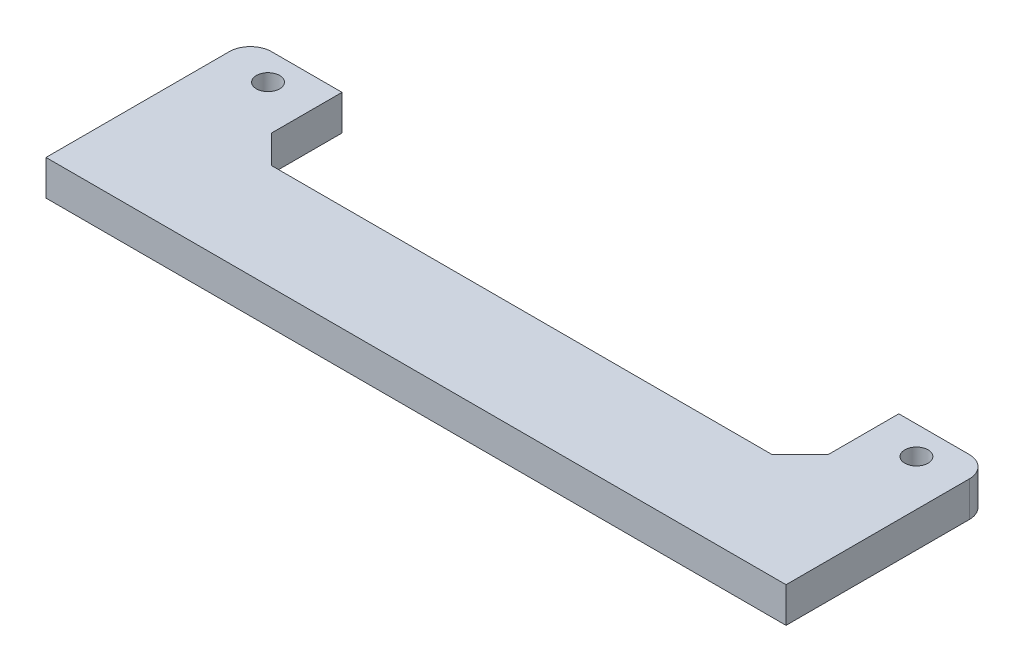
ISO-10303-21;
HEADER;
FILE_DESCRIPTION(('STEP AP214'),'2;1');
FILE_NAME('part.step','',(''),(''),'','','');
FILE_SCHEMA(('AUTOMOTIVE_DESIGN { 1 0 10303 214 1 1 1 1 }'));
ENDSEC;
DATA;
#1=APPLICATION_CONTEXT('core data for automotive mechanical design processes');
#2=APPLICATION_PROTOCOL_DEFINITION('international standard','automotive_design',2000,#1);
#3=PRODUCT_CONTEXT('',#1,'mechanical');
#4=PRODUCT('Part','Part','',(#3));
#5=PRODUCT_RELATED_PRODUCT_CATEGORY('part','',(#4));
#6=PRODUCT_DEFINITION_FORMATION('','',#4);
#7=PRODUCT_DEFINITION_CONTEXT('part definition',#1,'design');
#8=PRODUCT_DEFINITION('design','',#6,#7);
#9=PRODUCT_DEFINITION_SHAPE('','',#8);
#10=(LENGTH_UNIT() NAMED_UNIT(*) SI_UNIT(.MILLI.,.METRE.));
#11=(NAMED_UNIT(*) PLANE_ANGLE_UNIT() SI_UNIT($,.RADIAN.));
#12=(NAMED_UNIT(*) SI_UNIT($,.STERADIAN.) SOLID_ANGLE_UNIT());
#13=UNCERTAINTY_MEASURE_WITH_UNIT(LENGTH_MEASURE(1.E-05),#10,'distance_accuracy_value','');
#14=(GEOMETRIC_REPRESENTATION_CONTEXT(3) GLOBAL_UNCERTAINTY_ASSIGNED_CONTEXT((#13)) GLOBAL_UNIT_ASSIGNED_CONTEXT((#10,
#11,#12)) REPRESENTATION_CONTEXT('',''));
#15=CARTESIAN_POINT('',(0.,0.,0.));
#16=DIRECTION('',(0.,0.,1.));
#17=DIRECTION('',(1.,0.,0.));
#18=AXIS2_PLACEMENT_3D('',#15,#16,#17);
#19=CARTESIAN_POINT('',(0.,5.,0.));
#20=DIRECTION('',(0.,-1.,0.));
#21=DIRECTION('',(0.,0.,-1.));
#22=AXIS2_PLACEMENT_3D('',#19,#20,#21);
#23=PLANE('',#22);
#24=DIRECTION('',(0.,0.,1.));
#25=VECTOR('',#24,1.);
#26=CARTESIAN_POINT('',(52.5,5.,0.));
#27=LINE('',#26,#25);
#28=CARTESIAN_POINT('',(52.5,5.,-26.));
#29=VERTEX_POINT('',#28);
#30=CARTESIAN_POINT('',(52.5,5.,0.));
#31=VERTEX_POINT('',#30);
#32=EDGE_CURVE('E124',#29,#31,#27,.T.);
#33=ORIENTED_EDGE('',*,*,#32,.F.);
#34=CARTESIAN_POINT('',(49.5,5.,-26.));
#35=DIRECTION('',(0.,-1.,0.));
#36=DIRECTION('',(0.,0.,-1.));
#37=AXIS2_PLACEMENT_3D('',#34,#35,#36);
#38=CIRCLE('',#37,3.);
#39=CARTESIAN_POINT('',(49.5,5.,-29.));
#40=VERTEX_POINT('',#39);
#41=EDGE_CURVE('E211',#29,#40,#38,.F.);
#42=ORIENTED_EDGE('',*,*,#41,.T.);
#43=DIRECTION('',(1.,0.,0.));
#44=VECTOR('',#43,1.);
#45=CARTESIAN_POINT('',(52.5,5.,-29.));
#46=LINE('',#45,#44);
#47=CARTESIAN_POINT('',(39.5,5.,-29.));
#48=VERTEX_POINT('',#47);
#49=EDGE_CURVE('E133',#48,#40,#46,.T.);
#50=ORIENTED_EDGE('',*,*,#49,.F.);
#51=DIRECTION('',(0.,0.,-1.));
#52=VECTOR('',#51,1.);
#53=CARTESIAN_POINT('',(39.5,5.,-29.));
#54=LINE('',#53,#52);
#55=CARTESIAN_POINT('',(39.5,5.,-19.));
#56=VERTEX_POINT('',#55);
#57=EDGE_CURVE('E156',#56,#48,#54,.T.);
#58=ORIENTED_EDGE('',*,*,#57,.F.);
#59=DIRECTION('',(-0.707106781186553,0.,0.707106781186542));
#60=VECTOR('',#59,1.);
#61=CARTESIAN_POINT('',(10.2499999999997,5.,10.2499999999999));
#62=LINE('',#61,#60);
#63=CARTESIAN_POINT('',(35.5,5.,-15.));
#64=VERTEX_POINT('',#63);
#65=EDGE_CURVE('E196',#56,#64,#62,.T.);
#66=ORIENTED_EDGE('',*,*,#65,.T.);
#67=DIRECTION('',(-1.,0.,0.));
#68=VECTOR('',#67,1.);
#69=CARTESIAN_POINT('',(-39.5,5.,-15.));
#70=LINE('',#69,#68);
#71=CARTESIAN_POINT('',(-35.5,5.,-15.));
#72=VERTEX_POINT('',#71);
#73=EDGE_CURVE('E163',#64,#72,#70,.T.);
#74=ORIENTED_EDGE('',*,*,#73,.T.);
#75=DIRECTION('',(0.707106781186544,0.,0.707106781186551));
#76=VECTOR('',#75,1.);
#77=CARTESIAN_POINT('',(-10.2500000000002,5.,10.2500000000001));
#78=LINE('',#77,#76);
#79=CARTESIAN_POINT('',(-39.5,5.,-19.));
#80=VERTEX_POINT('',#79);
#81=EDGE_CURVE('E200',#72,#80,#78,.F.);
#82=ORIENTED_EDGE('',*,*,#81,.T.);
#83=DIRECTION('',(0.,0.,-1.));
#84=VECTOR('',#83,1.);
#85=CARTESIAN_POINT('',(-39.5,5.,-29.));
#86=LINE('',#85,#84);
#87=CARTESIAN_POINT('',(-39.5,5.,-29.));
#88=VERTEX_POINT('',#87);
#89=EDGE_CURVE('E166',#80,#88,#86,.T.);
#90=ORIENTED_EDGE('',*,*,#89,.T.);
#91=DIRECTION('',(-1.,0.,0.));
#92=VECTOR('',#91,1.);
#93=CARTESIAN_POINT('',(-52.5,5.,-29.));
#94=LINE('',#93,#92);
#95=CARTESIAN_POINT('',(-49.5,5.,-29.));
#96=VERTEX_POINT('',#95);
#97=EDGE_CURVE('E168',#88,#96,#94,.T.);
#98=ORIENTED_EDGE('',*,*,#97,.T.);
#99=CARTESIAN_POINT('',(-49.5,5.,-26.));
#100=DIRECTION('',(0.,-1.,0.));
#101=DIRECTION('',(0.,0.,-1.));
#102=AXIS2_PLACEMENT_3D('',#99,#100,#101);
#103=CIRCLE('',#102,3.);
#104=CARTESIAN_POINT('',(-52.5,5.,-26.));
#105=VERTEX_POINT('',#104);
#106=EDGE_CURVE('E50',#96,#105,#103,.F.);
#107=ORIENTED_EDGE('',*,*,#106,.T.);
#108=DIRECTION('',(0.,0.,1.));
#109=VECTOR('',#108,1.);
#110=CARTESIAN_POINT('',(-52.5,5.,0.));
#111=LINE('',#110,#109);
#112=CARTESIAN_POINT('',(-52.5,5.,0.));
#113=VERTEX_POINT('',#112);
#114=EDGE_CURVE('E139',#105,#113,#111,.T.);
#115=ORIENTED_EDGE('',*,*,#114,.T.);
#116=DIRECTION('',(1.,0.,0.));
#117=VECTOR('',#116,1.);
#118=CARTESIAN_POINT('',(0.,5.,0.));
#119=LINE('',#118,#117);
#120=EDGE_CURVE('E137',#113,#31,#119,.T.);
#121=ORIENTED_EDGE('',*,*,#120,.T.);
#122=EDGE_LOOP('',(#33,#42,#50,#58,#66,#74,#82,#90,#98,#107,#115,#121));
#123=FACE_BOUND('',#122,.T.);
#124=CARTESIAN_POINT('',(-46.,5.,-25.));
#125=DIRECTION('',(0.,1.,0.));
#126=DIRECTION('',(0.,0.,1.));
#127=AXIS2_PLACEMENT_3D('',#124,#125,#126);
#128=CIRCLE('',#127,1.65);
#129=CARTESIAN_POINT('',(-46.,5.,-23.35));
#130=VERTEX_POINT('',#129);
#131=EDGE_CURVE('E153',#130,#130,#128,.T.);
#132=ORIENTED_EDGE('',*,*,#131,.F.);
#133=EDGE_LOOP('',(#132));
#134=FACE_BOUND('',#133,.T.);
#135=CARTESIAN_POINT('',(46.,5.,-25.));
#136=DIRECTION('',(0.,-1.,0.));
#137=DIRECTION('',(0.,0.,1.));
#138=AXIS2_PLACEMENT_3D('',#135,#136,#137);
#139=CIRCLE('',#138,1.65);
#140=CARTESIAN_POINT('',(46.,5.,-23.35));
#141=VERTEX_POINT('',#140);
#142=EDGE_CURVE('E225',#141,#141,#139,.T.);
#143=ORIENTED_EDGE('',*,*,#142,.T.);
#144=EDGE_LOOP('',(#143));
#145=FACE_BOUND('',#144,.T.);
#146=ADVANCED_FACE('F35',(#123,#134,#145),#23,.F.);
#147=CARTESIAN_POINT('',(0.,0.,0.));
#148=DIRECTION('',(0.,-1.,0.));
#149=DIRECTION('',(0.,0.,-1.));
#150=AXIS2_PLACEMENT_3D('',#147,#148,#149);
#151=PLANE('',#150);
#152=DIRECTION('',(1.,0.,0.));
#153=VECTOR('',#152,1.);
#154=CARTESIAN_POINT('',(52.5,0.,-29.));
#155=LINE('',#154,#153);
#156=CARTESIAN_POINT('',(39.5,0.,-29.));
#157=VERTEX_POINT('',#156);
#158=CARTESIAN_POINT('',(49.5,0.,-29.));
#159=VERTEX_POINT('',#158);
#160=EDGE_CURVE('E224',#157,#159,#155,.T.);
#161=ORIENTED_EDGE('',*,*,#160,.T.);
#162=CARTESIAN_POINT('',(49.5,0.,-26.));
#163=DIRECTION('',(0.,-1.,0.));
#164=DIRECTION('',(0.,0.,-1.));
#165=AXIS2_PLACEMENT_3D('',#162,#163,#164);
#166=CIRCLE('',#165,3.);
#167=CARTESIAN_POINT('',(52.5,0.,-26.));
#168=VERTEX_POINT('',#167);
#169=EDGE_CURVE('E207',#159,#168,#166,.T.);
#170=ORIENTED_EDGE('',*,*,#169,.T.);
#171=DIRECTION('',(0.,0.,1.));
#172=VECTOR('',#171,1.);
#173=CARTESIAN_POINT('',(52.5,0.,0.));
#174=LINE('',#173,#172);
#175=CARTESIAN_POINT('',(52.5,0.,0.));
#176=VERTEX_POINT('',#175);
#177=EDGE_CURVE('E223',#168,#176,#174,.T.);
#178=ORIENTED_EDGE('',*,*,#177,.T.);
#179=DIRECTION('',(1.,0.,0.));
#180=VECTOR('',#179,1.);
#181=CARTESIAN_POINT('',(0.,0.,0.));
#182=LINE('',#181,#180);
#183=CARTESIAN_POINT('',(-52.5,0.,0.));
#184=VERTEX_POINT('',#183);
#185=EDGE_CURVE('E148',#184,#176,#182,.T.);
#186=ORIENTED_EDGE('',*,*,#185,.F.);
#187=DIRECTION('',(0.,0.,1.));
#188=VECTOR('',#187,1.);
#189=CARTESIAN_POINT('',(-52.5,0.,0.));
#190=LINE('',#189,#188);
#191=CARTESIAN_POINT('',(-52.5,0.,-26.));
#192=VERTEX_POINT('',#191);
#193=EDGE_CURVE('E177',#192,#184,#190,.T.);
#194=ORIENTED_EDGE('',*,*,#193,.F.);
#195=CARTESIAN_POINT('',(-49.5,0.,-26.));
#196=DIRECTION('',(0.,-1.,0.));
#197=DIRECTION('',(0.,0.,-1.));
#198=AXIS2_PLACEMENT_3D('',#195,#196,#197);
#199=CIRCLE('',#198,3.);
#200=CARTESIAN_POINT('',(-49.5,0.,-29.));
#201=VERTEX_POINT('',#200);
#202=EDGE_CURVE('E205',#192,#201,#199,.T.);
#203=ORIENTED_EDGE('',*,*,#202,.T.);
#204=DIRECTION('',(-1.,0.,0.));
#205=VECTOR('',#204,1.);
#206=CARTESIAN_POINT('',(-52.5,0.,-29.));
#207=LINE('',#206,#205);
#208=CARTESIAN_POINT('',(-39.5,0.,-29.));
#209=VERTEX_POINT('',#208);
#210=EDGE_CURVE('E175',#209,#201,#207,.T.);
#211=ORIENTED_EDGE('',*,*,#210,.F.);
#212=DIRECTION('',(0.,0.,-1.));
#213=VECTOR('',#212,1.);
#214=CARTESIAN_POINT('',(-39.5,0.,-29.));
#215=LINE('',#214,#213);
#216=CARTESIAN_POINT('',(-39.5,0.,-19.));
#217=VERTEX_POINT('',#216);
#218=EDGE_CURVE('E173',#217,#209,#215,.T.);
#219=ORIENTED_EDGE('',*,*,#218,.F.);
#220=DIRECTION('',(-0.707106781186544,0.,-0.707106781186551));
#221=VECTOR('',#220,1.);
#222=CARTESIAN_POINT('',(-39.5,0.,-19.));
#223=LINE('',#222,#221);
#224=CARTESIAN_POINT('',(-35.5,0.,-15.));
#225=VERTEX_POINT('',#224);
#226=EDGE_CURVE('E198',#217,#225,#223,.F.);
#227=ORIENTED_EDGE('',*,*,#226,.T.);
#228=DIRECTION('',(-1.,0.,0.));
#229=VECTOR('',#228,1.);
#230=CARTESIAN_POINT('',(-39.5,0.,-15.));
#231=LINE('',#230,#229);
#232=CARTESIAN_POINT('',(35.5,0.,-15.));
#233=VERTEX_POINT('',#232);
#234=EDGE_CURVE('E161',#233,#225,#231,.T.);
#235=ORIENTED_EDGE('',*,*,#234,.F.);
#236=DIRECTION('',(0.707106781186553,0.,-0.707106781186542));
#237=VECTOR('',#236,1.);
#238=CARTESIAN_POINT('',(35.5,0.,-15.));
#239=LINE('',#238,#237);
#240=CARTESIAN_POINT('',(39.5,0.,-19.));
#241=VERTEX_POINT('',#240);
#242=EDGE_CURVE('E194',#233,#241,#239,.T.);
#243=ORIENTED_EDGE('',*,*,#242,.T.);
#244=DIRECTION('',(0.,0.,-1.));
#245=VECTOR('',#244,1.);
#246=CARTESIAN_POINT('',(39.5,0.,-29.));
#247=LINE('',#246,#245);
#248=EDGE_CURVE('E134',#241,#157,#247,.T.);
#249=ORIENTED_EDGE('',*,*,#248,.T.);
#250=EDGE_LOOP('',(#161,#170,#178,#186,#194,#203,#211,#219,#227,#235,#243,#249));
#251=FACE_BOUND('',#250,.T.);
#252=CARTESIAN_POINT('',(-46.,0.,-25.));
#253=DIRECTION('',(0.,1.,0.));
#254=DIRECTION('',(0.,0.,1.));
#255=AXIS2_PLACEMENT_3D('',#252,#253,#254);
#256=CIRCLE('',#255,1.65);
#257=CARTESIAN_POINT('',(-46.,0.,-23.35));
#258=VERTEX_POINT('',#257);
#259=EDGE_CURVE('E149',#258,#258,#256,.T.);
#260=ORIENTED_EDGE('',*,*,#259,.T.);
#261=EDGE_LOOP('',(#260));
#262=FACE_BOUND('',#261,.T.);
#263=CARTESIAN_POINT('',(46.,0.,-25.));
#264=DIRECTION('',(0.,-1.,0.));
#265=DIRECTION('',(0.,0.,1.));
#266=AXIS2_PLACEMENT_3D('',#263,#264,#265);
#267=CIRCLE('',#266,1.65);
#268=CARTESIAN_POINT('',(46.,0.,-23.35));
#269=VERTEX_POINT('',#268);
#270=EDGE_CURVE('E229',#269,#269,#267,.T.);
#271=ORIENTED_EDGE('',*,*,#270,.F.);
#272=EDGE_LOOP('',(#271));
#273=FACE_BOUND('',#272,.T.);
#274=ADVANCED_FACE('F220',(#251,#262,#273),#151,.T.);
#275=CARTESIAN_POINT('',(-39.5,5.,-15.));
#276=DIRECTION('',(0.,0.,1.));
#277=DIRECTION('',(1.,0.,0.));
#278=AXIS2_PLACEMENT_3D('',#275,#276,#277);
#279=PLANE('',#278);
#280=ORIENTED_EDGE('',*,*,#73,.F.);
#281=DIRECTION('',(0.,-1.,0.));
#282=VECTOR('',#281,1.);
#283=CARTESIAN_POINT('',(35.5,5.,-15.));
#284=LINE('',#283,#282);
#285=EDGE_CURVE('E186',#64,#233,#284,.T.);
#286=ORIENTED_EDGE('',*,*,#285,.T.);
#287=ORIENTED_EDGE('',*,*,#234,.T.);
#288=DIRECTION('',(0.,1.,0.));
#289=VECTOR('',#288,1.);
#290=CARTESIAN_POINT('',(-35.5,5.,-15.));
#291=LINE('',#290,#289);
#292=EDGE_CURVE('E184',#225,#72,#291,.T.);
#293=ORIENTED_EDGE('',*,*,#292,.T.);
#294=EDGE_LOOP('',(#280,#286,#287,#293));
#295=FACE_BOUND('',#294,.T.);
#296=ADVANCED_FACE('F256',(#295),#279,.F.);
#297=CARTESIAN_POINT('',(-39.5,5.,-29.));
#298=DIRECTION('',(-1.,0.,0.));
#299=DIRECTION('',(0.,0.,1.));
#300=AXIS2_PLACEMENT_3D('',#297,#298,#299);
#301=PLANE('',#300);
#302=ORIENTED_EDGE('',*,*,#89,.F.);
#303=DIRECTION('',(0.,-1.,0.));
#304=VECTOR('',#303,1.);
#305=CARTESIAN_POINT('',(-39.5,0.,-19.));
#306=LINE('',#305,#304);
#307=EDGE_CURVE('E191',#80,#217,#306,.T.);
#308=ORIENTED_EDGE('',*,*,#307,.T.);
#309=ORIENTED_EDGE('',*,*,#218,.T.);
#310=DIRECTION('',(0.,-1.,0.));
#311=VECTOR('',#310,1.);
#312=CARTESIAN_POINT('',(-39.5,5.,-29.));
#313=LINE('',#312,#311);
#314=EDGE_CURVE('E181',#88,#209,#313,.T.);
#315=ORIENTED_EDGE('',*,*,#314,.F.);
#316=EDGE_LOOP('',(#302,#308,#309,#315));
#317=FACE_BOUND('',#316,.T.);
#318=ADVANCED_FACE('F263',(#317),#301,.F.);
#319=CARTESIAN_POINT('',(-52.5,5.,-29.));
#320=DIRECTION('',(0.,0.,1.));
#321=DIRECTION('',(1.,0.,0.));
#322=AXIS2_PLACEMENT_3D('',#319,#320,#321);
#323=PLANE('',#322);
#324=ORIENTED_EDGE('',*,*,#210,.T.);
#325=DIRECTION('',(0.,-1.,0.));
#326=VECTOR('',#325,1.);
#327=CARTESIAN_POINT('',(-49.5,5.,-29.));
#328=LINE('',#327,#326);
#329=EDGE_CURVE('E11',#201,#96,#328,.F.);
#330=ORIENTED_EDGE('',*,*,#329,.T.);
#331=ORIENTED_EDGE('',*,*,#97,.F.);
#332=ORIENTED_EDGE('',*,*,#314,.T.);
#333=EDGE_LOOP('',(#324,#330,#331,#332));
#334=FACE_BOUND('',#333,.T.);
#335=ADVANCED_FACE('F274',(#334),#323,.F.);
#336=CARTESIAN_POINT('',(-52.5,5.,0.));
#337=DIRECTION('',(1.,0.,0.));
#338=DIRECTION('',(0.,0.,-1.));
#339=AXIS2_PLACEMENT_3D('',#336,#337,#338);
#340=PLANE('',#339);
#341=ORIENTED_EDGE('',*,*,#114,.F.);
#342=DIRECTION('',(0.,-1.,0.));
#343=VECTOR('',#342,1.);
#344=CARTESIAN_POINT('',(-52.5,5.,-26.));
#345=LINE('',#344,#343);
#346=EDGE_CURVE('E43',#105,#192,#345,.T.);
#347=ORIENTED_EDGE('',*,*,#346,.T.);
#348=ORIENTED_EDGE('',*,*,#193,.T.);
#349=DIRECTION('',(0.,-1.,0.));
#350=VECTOR('',#349,1.);
#351=CARTESIAN_POINT('',(-52.5,5.,0.));
#352=LINE('',#351,#350);
#353=EDGE_CURVE('E143',#113,#184,#352,.T.);
#354=ORIENTED_EDGE('',*,*,#353,.F.);
#355=EDGE_LOOP('',(#341,#347,#348,#354));
#356=FACE_BOUND('',#355,.T.);
#357=ADVANCED_FACE('F216',(#356),#340,.F.);
#358=CARTESIAN_POINT('',(0.,5.,0.));
#359=DIRECTION('',(0.,0.,-1.));
#360=DIRECTION('',(-1.,0.,0.));
#361=AXIS2_PLACEMENT_3D('',#358,#359,#360);
#362=PLANE('',#361);
#363=ORIENTED_EDGE('',*,*,#185,.T.);
#364=DIRECTION('',(0.,-1.,0.));
#365=VECTOR('',#364,1.);
#366=CARTESIAN_POINT('',(52.5,5.,0.));
#367=LINE('',#366,#365);
#368=EDGE_CURVE('E129',#31,#176,#367,.T.);
#369=ORIENTED_EDGE('',*,*,#368,.F.);
#370=ORIENTED_EDGE('',*,*,#120,.F.);
#371=ORIENTED_EDGE('',*,*,#353,.T.);
#372=EDGE_LOOP('',(#363,#369,#370,#371));
#373=FACE_BOUND('',#372,.T.);
#374=ADVANCED_FACE('F146',(#373),#362,.F.);
#375=CARTESIAN_POINT('',(-46.,5.,-25.));
#376=DIRECTION('',(0.,-1.,0.));
#377=DIRECTION('',(0.,0.,-1.));
#378=AXIS2_PLACEMENT_3D('',#375,#376,#377);
#379=CYLINDRICAL_SURFACE('',#378,1.65);
#380=ORIENTED_EDGE('',*,*,#131,.T.);
#381=EDGE_LOOP('',(#380));
#382=FACE_BOUND('',#381,.T.);
#383=ORIENTED_EDGE('',*,*,#259,.F.);
#384=EDGE_LOOP('',(#383));
#385=FACE_BOUND('',#384,.T.);
#386=ADVANCED_FACE('F271',(#382,#385),#379,.F.);
#387=CARTESIAN_POINT('',(52.5,5.,0.));
#388=DIRECTION('',(1.,0.,0.));
#389=DIRECTION('',(0.,0.,-1.));
#390=AXIS2_PLACEMENT_3D('',#387,#388,#389);
#391=PLANE('',#390);
#392=ORIENTED_EDGE('',*,*,#177,.F.);
#393=DIRECTION('',(0.,-1.,0.));
#394=VECTOR('',#393,1.);
#395=CARTESIAN_POINT('',(52.5,5.,-26.));
#396=LINE('',#395,#394);
#397=EDGE_CURVE('E131',#168,#29,#396,.F.);
#398=ORIENTED_EDGE('',*,*,#397,.T.);
#399=ORIENTED_EDGE('',*,*,#32,.T.);
#400=ORIENTED_EDGE('',*,*,#368,.T.);
#401=EDGE_LOOP('',(#392,#398,#399,#400));
#402=FACE_BOUND('',#401,.T.);
#403=ADVANCED_FACE('F127',(#402),#391,.T.);
#404=CARTESIAN_POINT('',(52.5,5.,-29.));
#405=DIRECTION('',(0.,0.,-1.));
#406=DIRECTION('',(-1.,0.,0.));
#407=AXIS2_PLACEMENT_3D('',#404,#405,#406);
#408=PLANE('',#407);
#409=ORIENTED_EDGE('',*,*,#49,.T.);
#410=DIRECTION('',(0.,-1.,0.));
#411=VECTOR('',#410,1.);
#412=CARTESIAN_POINT('',(49.5,5.,-29.));
#413=LINE('',#412,#411);
#414=EDGE_CURVE('E202',#40,#159,#413,.T.);
#415=ORIENTED_EDGE('',*,*,#414,.T.);
#416=ORIENTED_EDGE('',*,*,#160,.F.);
#417=DIRECTION('',(0.,-1.,0.));
#418=VECTOR('',#417,1.);
#419=CARTESIAN_POINT('',(39.5,5.,-29.));
#420=LINE('',#419,#418);
#421=EDGE_CURVE('E150',#48,#157,#420,.T.);
#422=ORIENTED_EDGE('',*,*,#421,.F.);
#423=EDGE_LOOP('',(#409,#415,#416,#422));
#424=FACE_BOUND('',#423,.T.);
#425=ADVANCED_FACE('F244',(#424),#408,.T.);
#426=CARTESIAN_POINT('',(39.5,5.,-29.));
#427=DIRECTION('',(-1.,0.,0.));
#428=DIRECTION('',(0.,0.,1.));
#429=AXIS2_PLACEMENT_3D('',#426,#427,#428);
#430=PLANE('',#429);
#431=ORIENTED_EDGE('',*,*,#248,.F.);
#432=DIRECTION('',(0.,1.,0.));
#433=VECTOR('',#432,1.);
#434=CARTESIAN_POINT('',(39.5,5.,-19.));
#435=LINE('',#434,#433);
#436=EDGE_CURVE('E189',#241,#56,#435,.T.);
#437=ORIENTED_EDGE('',*,*,#436,.T.);
#438=ORIENTED_EDGE('',*,*,#57,.T.);
#439=ORIENTED_EDGE('',*,*,#421,.T.);
#440=EDGE_LOOP('',(#431,#437,#438,#439));
#441=FACE_BOUND('',#440,.T.);
#442=ADVANCED_FACE('F239',(#441),#430,.T.);
#443=CARTESIAN_POINT('',(46.,5.,-25.));
#444=DIRECTION('',(0.,-1.,0.));
#445=DIRECTION('',(0.,0.,-1.));
#446=AXIS2_PLACEMENT_3D('',#443,#444,#445);
#447=CYLINDRICAL_SURFACE('',#446,1.65);
#448=ORIENTED_EDGE('',*,*,#142,.F.);
#449=EDGE_LOOP('',(#448));
#450=FACE_BOUND('',#449,.T.);
#451=ORIENTED_EDGE('',*,*,#270,.T.);
#452=EDGE_LOOP('',(#451));
#453=FACE_BOUND('',#452,.T.);
#454=ADVANCED_FACE('F253',(#450,#453),#447,.F.);
#455=CARTESIAN_POINT('',(35.5,5.,-15.));
#456=DIRECTION('',(0.707106781186542,0.,0.707106781186553));
#457=DIRECTION('',(0.,-1.,0.));
#458=AXIS2_PLACEMENT_3D('',#455,#456,#457);
#459=PLANE('',#458);
#460=ORIENTED_EDGE('',*,*,#65,.F.);
#461=ORIENTED_EDGE('',*,*,#436,.F.);
#462=ORIENTED_EDGE('',*,*,#242,.F.);
#463=ORIENTED_EDGE('',*,*,#285,.F.);
#464=EDGE_LOOP('',(#460,#461,#462,#463));
#465=FACE_BOUND('',#464,.T.);
#466=ADVANCED_FACE('F280',(#465),#459,.F.);
#467=CARTESIAN_POINT('',(-39.5,5.,-19.));
#468=DIRECTION('',(0.707106781186551,0.,-0.707106781186544));
#469=DIRECTION('',(0.,1.,0.));
#470=AXIS2_PLACEMENT_3D('',#467,#468,#469);
#471=PLANE('',#470);
#472=ORIENTED_EDGE('',*,*,#81,.F.);
#473=ORIENTED_EDGE('',*,*,#292,.F.);
#474=ORIENTED_EDGE('',*,*,#226,.F.);
#475=ORIENTED_EDGE('',*,*,#307,.F.);
#476=EDGE_LOOP('',(#472,#473,#474,#475));
#477=FACE_BOUND('',#476,.T.);
#478=ADVANCED_FACE('F286',(#477),#471,.T.);
#479=CARTESIAN_POINT('',(49.5,5.,-26.));
#480=DIRECTION('',(0.,-1.,0.));
#481=DIRECTION('',(0.,0.,-1.));
#482=AXIS2_PLACEMENT_3D('',#479,#480,#481);
#483=CYLINDRICAL_SURFACE('',#482,3.);
#484=ORIENTED_EDGE('',*,*,#41,.F.);
#485=ORIENTED_EDGE('',*,*,#397,.F.);
#486=ORIENTED_EDGE('',*,*,#169,.F.);
#487=ORIENTED_EDGE('',*,*,#414,.F.);
#488=EDGE_LOOP('',(#484,#485,#486,#487));
#489=FACE_BOUND('',#488,.T.);
#490=ADVANCED_FACE('F247',(#489),#483,.T.);
#491=CARTESIAN_POINT('',(-49.5,5.,-26.));
#492=DIRECTION('',(0.,-1.,0.));
#493=DIRECTION('',(0.,0.,-1.));
#494=AXIS2_PLACEMENT_3D('',#491,#492,#493);
#495=CYLINDRICAL_SURFACE('',#494,3.);
#496=ORIENTED_EDGE('',*,*,#106,.F.);
#497=ORIENTED_EDGE('',*,*,#329,.F.);
#498=ORIENTED_EDGE('',*,*,#202,.F.);
#499=ORIENTED_EDGE('',*,*,#346,.F.);
#500=EDGE_LOOP('',(#496,#497,#498,#499));
#501=FACE_BOUND('',#500,.T.);
#502=ADVANCED_FACE('F37',(#501),#495,.T.);
#503=CLOSED_SHELL('',(#146,#274,#296,#318,#335,#357,#374,#386,#403,#425,#442,#454,#466,#478,
#490,#502));
#504=MANIFOLD_SOLID_BREP('B2',#503);
#505=ADVANCED_BREP_SHAPE_REPRESENTATION('',(#18,#504),#14);
#506=SHAPE_DEFINITION_REPRESENTATION(#9,#505);
ENDSEC;
END-ISO-10303-21;
